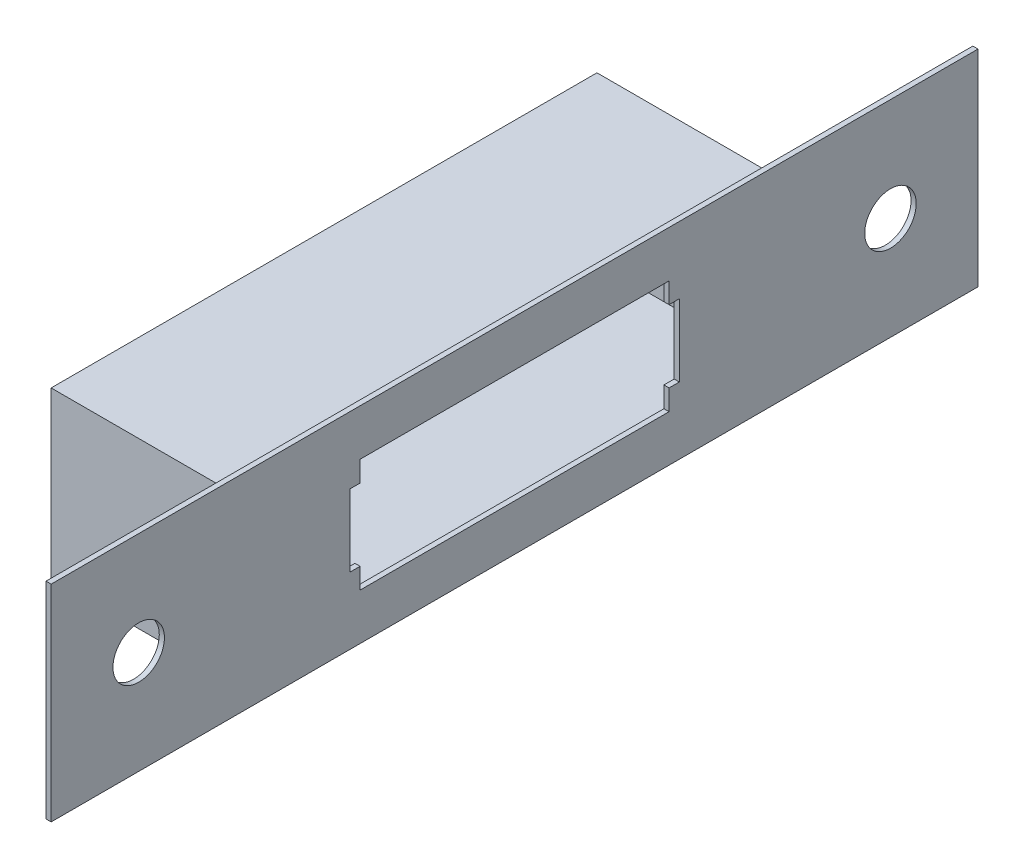
ISO-10303-21;
HEADER;
FILE_DESCRIPTION(('STEP AP214'),'2;1');
FILE_NAME('part.step','',(''),(''),'','','');
FILE_SCHEMA(('AUTOMOTIVE_DESIGN { 1 0 10303 214 1 1 1 1 }'));
ENDSEC;
DATA;
#1=APPLICATION_CONTEXT('core data for automotive mechanical design processes');
#2=APPLICATION_PROTOCOL_DEFINITION('international standard','automotive_design',2000,#1);
#3=PRODUCT_CONTEXT('',#1,'mechanical');
#4=PRODUCT('Part','Part','',(#3));
#5=PRODUCT_RELATED_PRODUCT_CATEGORY('part','',(#4));
#6=PRODUCT_DEFINITION_FORMATION('','',#4);
#7=PRODUCT_DEFINITION_CONTEXT('part definition',#1,'design');
#8=PRODUCT_DEFINITION('design','',#6,#7);
#9=PRODUCT_DEFINITION_SHAPE('','',#8);
#10=(LENGTH_UNIT() NAMED_UNIT(*) SI_UNIT(.MILLI.,.METRE.));
#11=(NAMED_UNIT(*) PLANE_ANGLE_UNIT() SI_UNIT($,.RADIAN.));
#12=(NAMED_UNIT(*) SI_UNIT($,.STERADIAN.) SOLID_ANGLE_UNIT());
#13=UNCERTAINTY_MEASURE_WITH_UNIT(LENGTH_MEASURE(1.E-05),#10,'distance_accuracy_value','');
#14=(GEOMETRIC_REPRESENTATION_CONTEXT(3) GLOBAL_UNCERTAINTY_ASSIGNED_CONTEXT((#13)) GLOBAL_UNIT_ASSIGNED_CONTEXT((#10,
#11,#12)) REPRESENTATION_CONTEXT('',''));
#15=CARTESIAN_POINT('',(0.,0.,0.));
#16=DIRECTION('',(0.,0.,1.));
#17=DIRECTION('',(1.,0.,0.));
#18=AXIS2_PLACEMENT_3D('',#15,#16,#17);
#19=CARTESIAN_POINT('',(18.,-8.,-26.5));
#20=DIRECTION('',(0.,0.,1.));
#21=DIRECTION('',(1.,0.,0.));
#22=AXIS2_PLACEMENT_3D('',#19,#20,#21);
#23=PLANE('',#22);
#24=DIRECTION('',(0.,1.,0.));
#25=VECTOR('',#24,1.);
#26=CARTESIAN_POINT('',(0.,-8.,-26.5));
#27=LINE('',#26,#25);
#28=CARTESIAN_POINT('',(0.,-8.,-26.5));
#29=VERTEX_POINT('',#28);
#30=CARTESIAN_POINT('',(0.,8.,-26.5));
#31=VERTEX_POINT('',#30);
#32=EDGE_CURVE('E416',#29,#31,#27,.T.);
#33=ORIENTED_EDGE('',*,*,#32,.T.);
#34=DIRECTION('',(-1.,0.,0.));
#35=VECTOR('',#34,1.);
#36=CARTESIAN_POINT('',(18.,8.,-26.5));
#37=LINE('',#36,#35);
#38=CARTESIAN_POINT('',(18.,8.,-26.5));
#39=VERTEX_POINT('',#38);
#40=EDGE_CURVE('E11',#39,#31,#37,.T.);
#41=ORIENTED_EDGE('',*,*,#40,.F.);
#42=DIRECTION('',(0.,1.,0.));
#43=VECTOR('',#42,1.);
#44=CARTESIAN_POINT('',(18.,-8.,-26.5));
#45=LINE('',#44,#43);
#46=CARTESIAN_POINT('',(18.,-8.,-26.5));
#47=VERTEX_POINT('',#46);
#48=EDGE_CURVE('E453',#47,#39,#45,.T.);
#49=ORIENTED_EDGE('',*,*,#48,.F.);
#50=DIRECTION('',(-1.,0.,0.));
#51=VECTOR('',#50,1.);
#52=CARTESIAN_POINT('',(18.,-8.,-26.5));
#53=LINE('',#52,#51);
#54=EDGE_CURVE('E467',#47,#29,#53,.T.);
#55=ORIENTED_EDGE('',*,*,#54,.T.);
#56=EDGE_LOOP('',(#33,#41,#49,#55));
#57=FACE_BOUND('',#56,.T.);
#58=ADVANCED_FACE('F44',(#57),#23,.F.);
#59=CARTESIAN_POINT('',(18.,8.,26.5));
#60=DIRECTION('',(0.,-1.,0.));
#61=DIRECTION('',(0.,0.,-1.));
#62=AXIS2_PLACEMENT_3D('',#59,#60,#61);
#63=PLANE('',#62);
#64=DIRECTION('',(0.,0.,1.));
#65=VECTOR('',#64,1.);
#66=CARTESIAN_POINT('',(0.,8.,26.5));
#67=LINE('',#66,#65);
#68=CARTESIAN_POINT('',(0.,8.,26.5));
#69=VERTEX_POINT('',#68);
#70=EDGE_CURVE('E471',#31,#69,#67,.T.);
#71=ORIENTED_EDGE('',*,*,#70,.T.);
#72=DIRECTION('',(-1.,0.,0.));
#73=VECTOR('',#72,1.);
#74=CARTESIAN_POINT('',(18.,8.,26.5));
#75=LINE('',#74,#73);
#76=CARTESIAN_POINT('',(18.,8.,26.5));
#77=VERTEX_POINT('',#76);
#78=EDGE_CURVE('E53',#77,#69,#75,.T.);
#79=ORIENTED_EDGE('',*,*,#78,.F.);
#80=DIRECTION('',(0.,0.,1.));
#81=VECTOR('',#80,1.);
#82=CARTESIAN_POINT('',(18.,8.,26.5));
#83=LINE('',#82,#81);
#84=EDGE_CURVE('E87',#39,#77,#83,.T.);
#85=ORIENTED_EDGE('',*,*,#84,.F.);
#86=ORIENTED_EDGE('',*,*,#40,.T.);
#87=EDGE_LOOP('',(#71,#79,#85,#86));
#88=FACE_BOUND('',#87,.T.);
#89=ADVANCED_FACE('F516',(#88),#63,.F.);
#90=CARTESIAN_POINT('',(18.,-8.,26.5));
#91=DIRECTION('',(0.,0.,-1.));
#92=DIRECTION('',(-1.,0.,0.));
#93=AXIS2_PLACEMENT_3D('',#90,#91,#92);
#94=PLANE('',#93);
#95=DIRECTION('',(0.,-1.,0.));
#96=VECTOR('',#95,1.);
#97=CARTESIAN_POINT('',(0.,-8.,26.5));
#98=LINE('',#97,#96);
#99=CARTESIAN_POINT('',(0.,-8.,26.5));
#100=VERTEX_POINT('',#99);
#101=EDGE_CURVE('E77',#69,#100,#98,.T.);
#102=ORIENTED_EDGE('',*,*,#101,.T.);
#103=DIRECTION('',(-1.,0.,0.));
#104=VECTOR('',#103,1.);
#105=CARTESIAN_POINT('',(18.,-8.,26.5));
#106=LINE('',#105,#104);
#107=CARTESIAN_POINT('',(18.,-8.,26.5));
#108=VERTEX_POINT('',#107);
#109=EDGE_CURVE('E61',#108,#100,#106,.T.);
#110=ORIENTED_EDGE('',*,*,#109,.F.);
#111=DIRECTION('',(0.,-1.,0.));
#112=VECTOR('',#111,1.);
#113=CARTESIAN_POINT('',(18.,-8.,26.5));
#114=LINE('',#113,#112);
#115=EDGE_CURVE('E459',#77,#108,#114,.T.);
#116=ORIENTED_EDGE('',*,*,#115,.F.);
#117=ORIENTED_EDGE('',*,*,#78,.T.);
#118=EDGE_LOOP('',(#102,#110,#116,#117));
#119=FACE_BOUND('',#118,.T.);
#120=ADVANCED_FACE('F482',(#119),#94,.F.);
#121=CARTESIAN_POINT('',(18.,-8.,26.5));
#122=DIRECTION('',(0.,1.,0.));
#123=DIRECTION('',(0.,0.,1.));
#124=AXIS2_PLACEMENT_3D('',#121,#122,#123);
#125=PLANE('',#124);
#126=DIRECTION('',(0.,0.,-1.));
#127=VECTOR('',#126,1.);
#128=CARTESIAN_POINT('',(0.,-8.,26.5));
#129=LINE('',#128,#127);
#130=EDGE_CURVE('E82',#100,#29,#129,.T.);
#131=ORIENTED_EDGE('',*,*,#130,.T.);
#132=ORIENTED_EDGE('',*,*,#54,.F.);
#133=DIRECTION('',(0.,0.,-1.));
#134=VECTOR('',#133,1.);
#135=CARTESIAN_POINT('',(18.,-8.,26.5));
#136=LINE('',#135,#134);
#137=EDGE_CURVE('E463',#108,#47,#136,.T.);
#138=ORIENTED_EDGE('',*,*,#137,.F.);
#139=ORIENTED_EDGE('',*,*,#109,.T.);
#140=EDGE_LOOP('',(#131,#132,#138,#139));
#141=FACE_BOUND('',#140,.T.);
#142=ADVANCED_FACE('F487',(#141),#125,.F.);
#143=CARTESIAN_POINT('',(0.,0.,0.));
#144=DIRECTION('',(-1.,0.,0.));
#145=DIRECTION('',(0.,0.,1.));
#146=AXIS2_PLACEMENT_3D('',#143,#144,#145);
#147=PLANE('',#146);
#148=ORIENTED_EDGE('',*,*,#32,.F.);
#149=ORIENTED_EDGE('',*,*,#130,.F.);
#150=ORIENTED_EDGE('',*,*,#101,.F.);
#151=ORIENTED_EDGE('',*,*,#70,.F.);
#152=EDGE_LOOP('',(#148,#149,#150,#151));
#153=FACE_BOUND('',#152,.T.);
#154=ADVANCED_FACE('F485',(#153),#147,.T.);
#155=CARTESIAN_POINT('',(18.,0.,0.));
#156=DIRECTION('',(-1.,0.,0.));
#157=DIRECTION('',(0.,0.,1.));
#158=AXIS2_PLACEMENT_3D('',#155,#156,#157);
#159=PLANE('',#158);
#160=DIRECTION('',(0.,0.,1.));
#161=VECTOR('',#160,1.);
#162=CARTESIAN_POINT('',(18.,3.5,-15.));
#163=LINE('',#162,#161);
#164=CARTESIAN_POINT('',(18.,3.5,-16.));
#165=VERTEX_POINT('',#164);
#166=CARTESIAN_POINT('',(18.,3.5,-15.));
#167=VERTEX_POINT('',#166);
#168=EDGE_CURVE('E227',#165,#167,#163,.T.);
#169=ORIENTED_EDGE('',*,*,#168,.T.);
#170=DIRECTION('',(0.,1.,0.));
#171=VECTOR('',#170,1.);
#172=CARTESIAN_POINT('',(18.,5.5,-15.));
#173=LINE('',#172,#171);
#174=CARTESIAN_POINT('',(18.,5.5,-15.));
#175=VERTEX_POINT('',#174);
#176=EDGE_CURVE('E275',#167,#175,#173,.T.);
#177=ORIENTED_EDGE('',*,*,#176,.T.);
#178=DIRECTION('',(0.,0.,1.));
#179=VECTOR('',#178,1.);
#180=CARTESIAN_POINT('',(18.,5.5,15.));
#181=LINE('',#180,#179);
#182=CARTESIAN_POINT('',(18.,5.5,15.));
#183=VERTEX_POINT('',#182);
#184=EDGE_CURVE('E233',#175,#183,#181,.T.);
#185=ORIENTED_EDGE('',*,*,#184,.T.);
#186=DIRECTION('',(0.,-1.,0.));
#187=VECTOR('',#186,1.);
#188=CARTESIAN_POINT('',(18.,5.5,15.));
#189=LINE('',#188,#187);
#190=CARTESIAN_POINT('',(18.,3.5,15.));
#191=VERTEX_POINT('',#190);
#192=EDGE_CURVE('E280',#183,#191,#189,.T.);
#193=ORIENTED_EDGE('',*,*,#192,.T.);
#194=DIRECTION('',(0.,0.,1.));
#195=VECTOR('',#194,1.);
#196=CARTESIAN_POINT('',(18.,3.5,16.));
#197=LINE('',#196,#195);
#198=CARTESIAN_POINT('',(18.,3.5,16.));
#199=VERTEX_POINT('',#198);
#200=EDGE_CURVE('E284',#191,#199,#197,.T.);
#201=ORIENTED_EDGE('',*,*,#200,.T.);
#202=DIRECTION('',(0.,-1.,0.));
#203=VECTOR('',#202,1.);
#204=CARTESIAN_POINT('',(18.,-3.5,16.));
#205=LINE('',#204,#203);
#206=CARTESIAN_POINT('',(18.,-3.5,16.));
#207=VERTEX_POINT('',#206);
#208=EDGE_CURVE('E288',#199,#207,#205,.T.);
#209=ORIENTED_EDGE('',*,*,#208,.T.);
#210=DIRECTION('',(0.,0.,-1.));
#211=VECTOR('',#210,1.);
#212=CARTESIAN_POINT('',(18.,-3.5,16.));
#213=LINE('',#212,#211);
#214=CARTESIAN_POINT('',(18.,-3.5,15.));
#215=VERTEX_POINT('',#214);
#216=EDGE_CURVE('E292',#207,#215,#213,.T.);
#217=ORIENTED_EDGE('',*,*,#216,.T.);
#218=DIRECTION('',(0.,-1.,0.));
#219=VECTOR('',#218,1.);
#220=CARTESIAN_POINT('',(18.,-5.5,15.));
#221=LINE('',#220,#219);
#222=CARTESIAN_POINT('',(18.,-5.5,15.));
#223=VERTEX_POINT('',#222);
#224=EDGE_CURVE('E296',#215,#223,#221,.T.);
#225=ORIENTED_EDGE('',*,*,#224,.T.);
#226=DIRECTION('',(0.,0.,-1.));
#227=VECTOR('',#226,1.);
#228=CARTESIAN_POINT('',(18.,-5.5,15.));
#229=LINE('',#228,#227);
#230=CARTESIAN_POINT('',(18.,-5.5,-15.));
#231=VERTEX_POINT('',#230);
#232=EDGE_CURVE('E300',#223,#231,#229,.T.);
#233=ORIENTED_EDGE('',*,*,#232,.T.);
#234=DIRECTION('',(0.,1.,0.));
#235=VECTOR('',#234,1.);
#236=CARTESIAN_POINT('',(18.,-3.5,-15.));
#237=LINE('',#236,#235);
#238=CARTESIAN_POINT('',(18.,-3.5,-15.));
#239=VERTEX_POINT('',#238);
#240=EDGE_CURVE('E304',#231,#239,#237,.T.);
#241=ORIENTED_EDGE('',*,*,#240,.T.);
#242=DIRECTION('',(0.,0.,-1.));
#243=VECTOR('',#242,1.);
#244=CARTESIAN_POINT('',(18.,-3.5,-16.));
#245=LINE('',#244,#243);
#246=CARTESIAN_POINT('',(18.,-3.5,-16.));
#247=VERTEX_POINT('',#246);
#248=EDGE_CURVE('E308',#239,#247,#245,.T.);
#249=ORIENTED_EDGE('',*,*,#248,.T.);
#250=DIRECTION('',(0.,1.,0.));
#251=VECTOR('',#250,1.);
#252=CARTESIAN_POINT('',(18.,-3.5,-16.));
#253=LINE('',#252,#251);
#254=EDGE_CURVE('E312',#247,#165,#253,.T.);
#255=ORIENTED_EDGE('',*,*,#254,.T.);
#256=EDGE_LOOP('',(#169,#177,#185,#193,#201,#209,#217,#225,#233,#241,#249,#255));
#257=FACE_BOUND('',#256,.T.);
#258=DIRECTION('',(0.,1.,0.));
#259=VECTOR('',#258,1.);
#260=CARTESIAN_POINT('',(18.,0.,-26.));
#261=LINE('',#260,#259);
#262=CARTESIAN_POINT('',(18.,-7.5,-26.));
#263=VERTEX_POINT('',#262);
#264=CARTESIAN_POINT('',(18.,7.5,-26.));
#265=VERTEX_POINT('',#264);
#266=EDGE_CURVE('E438',#263,#265,#261,.T.);
#267=ORIENTED_EDGE('',*,*,#266,.F.);
#268=DIRECTION('',(0.,0.,-1.));
#269=VECTOR('',#268,1.);
#270=CARTESIAN_POINT('',(18.,-7.5,0.));
#271=LINE('',#270,#269);
#272=CARTESIAN_POINT('',(18.,-7.5,26.));
#273=VERTEX_POINT('',#272);
#274=EDGE_CURVE('E423',#273,#263,#271,.T.);
#275=ORIENTED_EDGE('',*,*,#274,.F.);
#276=DIRECTION('',(0.,-1.,0.));
#277=VECTOR('',#276,1.);
#278=CARTESIAN_POINT('',(18.,0.,26.));
#279=LINE('',#278,#277);
#280=CARTESIAN_POINT('',(18.,7.5,26.));
#281=VERTEX_POINT('',#280);
#282=EDGE_CURVE('E446',#281,#273,#279,.T.);
#283=ORIENTED_EDGE('',*,*,#282,.F.);
#284=DIRECTION('',(0.,0.,1.));
#285=VECTOR('',#284,1.);
#286=CARTESIAN_POINT('',(18.,7.5,0.));
#287=LINE('',#286,#285);
#288=EDGE_CURVE('E442',#265,#281,#287,.T.);
#289=ORIENTED_EDGE('',*,*,#288,.F.);
#290=EDGE_LOOP('',(#267,#275,#283,#289));
#291=FACE_BOUND('',#290,.T.);
#292=ADVANCED_FACE('F494',(#257,#291),#159,.T.);
#293=CARTESIAN_POINT('',(18.5,0.,0.));
#294=DIRECTION('',(-1.,0.,0.));
#295=DIRECTION('',(0.,0.,1.));
#296=AXIS2_PLACEMENT_3D('',#293,#294,#295);
#297=PLANE('',#296);
#298=CARTESIAN_POINT('',(18.5,0.,36.5));
#299=DIRECTION('',(1.,0.,0.));
#300=DIRECTION('',(0.,0.,-1.));
#301=AXIS2_PLACEMENT_3D('',#298,#299,#300);
#302=CIRCLE('',#301,2.5);
#303=CARTESIAN_POINT('',(18.5,0.,34.));
#304=VERTEX_POINT('',#303);
#305=EDGE_CURVE('E350',#304,#304,#302,.T.);
#306=ORIENTED_EDGE('',*,*,#305,.F.);
#307=EDGE_LOOP('',(#306));
#308=FACE_BOUND('',#307,.T.);
#309=CARTESIAN_POINT('',(18.5,0.,-36.5));
#310=DIRECTION('',(1.,0.,0.));
#311=DIRECTION('',(0.,0.,-1.));
#312=AXIS2_PLACEMENT_3D('',#309,#310,#311);
#313=CIRCLE('',#312,2.5);
#314=CARTESIAN_POINT('',(18.5,0.,-39.));
#315=VERTEX_POINT('',#314);
#316=EDGE_CURVE('E358',#315,#315,#313,.T.);
#317=ORIENTED_EDGE('',*,*,#316,.F.);
#318=EDGE_LOOP('',(#317));
#319=FACE_BOUND('',#318,.T.);
#320=DIRECTION('',(0.,1.,0.));
#321=VECTOR('',#320,1.);
#322=CARTESIAN_POINT('',(18.5,-10.,-45.));
#323=LINE('',#322,#321);
#324=CARTESIAN_POINT('',(18.5,-10.,-45.));
#325=VERTEX_POINT('',#324);
#326=CARTESIAN_POINT('',(18.5,10.,-45.));
#327=VERTEX_POINT('',#326);
#328=EDGE_CURVE('E366',#325,#327,#323,.T.);
#329=ORIENTED_EDGE('',*,*,#328,.T.);
#330=DIRECTION('',(0.,0.,1.));
#331=VECTOR('',#330,1.);
#332=CARTESIAN_POINT('',(18.5,10.,45.));
#333=LINE('',#332,#331);
#334=CARTESIAN_POINT('',(18.5,10.,45.));
#335=VERTEX_POINT('',#334);
#336=EDGE_CURVE('E370',#327,#335,#333,.T.);
#337=ORIENTED_EDGE('',*,*,#336,.T.);
#338=DIRECTION('',(0.,-1.,0.));
#339=VECTOR('',#338,1.);
#340=CARTESIAN_POINT('',(18.5,-10.,45.));
#341=LINE('',#340,#339);
#342=CARTESIAN_POINT('',(18.5,-10.,45.));
#343=VERTEX_POINT('',#342);
#344=EDGE_CURVE('E374',#335,#343,#341,.T.);
#345=ORIENTED_EDGE('',*,*,#344,.T.);
#346=DIRECTION('',(0.,0.,-1.));
#347=VECTOR('',#346,1.);
#348=CARTESIAN_POINT('',(18.5,-10.,45.));
#349=LINE('',#348,#347);
#350=EDGE_CURVE('E377',#343,#325,#349,.T.);
#351=ORIENTED_EDGE('',*,*,#350,.T.);
#352=EDGE_LOOP('',(#329,#337,#345,#351));
#353=FACE_BOUND('',#352,.T.);
#354=DIRECTION('',(0.,1.,0.));
#355=VECTOR('',#354,1.);
#356=CARTESIAN_POINT('',(18.5,5.5,-15.));
#357=LINE('',#356,#355);
#358=CARTESIAN_POINT('',(18.5,3.5,-15.));
#359=VERTEX_POINT('',#358);
#360=CARTESIAN_POINT('',(18.5,5.5,-15.));
#361=VERTEX_POINT('',#360);
#362=EDGE_CURVE('E215',#359,#361,#357,.T.);
#363=ORIENTED_EDGE('',*,*,#362,.F.);
#364=DIRECTION('',(0.,0.,1.));
#365=VECTOR('',#364,1.);
#366=CARTESIAN_POINT('',(18.5,3.5,-15.));
#367=LINE('',#366,#365);
#368=CARTESIAN_POINT('',(18.5,3.5,-16.));
#369=VERTEX_POINT('',#368);
#370=EDGE_CURVE('E272',#369,#359,#367,.T.);
#371=ORIENTED_EDGE('',*,*,#370,.F.);
#372=DIRECTION('',(0.,1.,0.));
#373=VECTOR('',#372,1.);
#374=CARTESIAN_POINT('',(18.5,-3.5,-16.));
#375=LINE('',#374,#373);
#376=CARTESIAN_POINT('',(18.5,-3.5,-16.));
#377=VERTEX_POINT('',#376);
#378=EDGE_CURVE('E268',#377,#369,#375,.T.);
#379=ORIENTED_EDGE('',*,*,#378,.F.);
#380=DIRECTION('',(0.,0.,-1.));
#381=VECTOR('',#380,1.);
#382=CARTESIAN_POINT('',(18.5,-3.5,-16.));
#383=LINE('',#382,#381);
#384=CARTESIAN_POINT('',(18.5,-3.5,-15.));
#385=VERTEX_POINT('',#384);
#386=EDGE_CURVE('E265',#385,#377,#383,.T.);
#387=ORIENTED_EDGE('',*,*,#386,.F.);
#388=DIRECTION('',(0.,1.,0.));
#389=VECTOR('',#388,1.);
#390=CARTESIAN_POINT('',(18.5,-3.5,-15.));
#391=LINE('',#390,#389);
#392=CARTESIAN_POINT('',(18.5,-5.5,-15.));
#393=VERTEX_POINT('',#392);
#394=EDGE_CURVE('E262',#393,#385,#391,.T.);
#395=ORIENTED_EDGE('',*,*,#394,.F.);
#396=DIRECTION('',(0.,0.,-1.));
#397=VECTOR('',#396,1.);
#398=CARTESIAN_POINT('',(18.5,-5.5,15.));
#399=LINE('',#398,#397);
#400=CARTESIAN_POINT('',(18.5,-5.5,15.));
#401=VERTEX_POINT('',#400);
#402=EDGE_CURVE('E259',#401,#393,#399,.T.);
#403=ORIENTED_EDGE('',*,*,#402,.F.);
#404=DIRECTION('',(0.,-1.,0.));
#405=VECTOR('',#404,1.);
#406=CARTESIAN_POINT('',(18.5,-5.5,15.));
#407=LINE('',#406,#405);
#408=CARTESIAN_POINT('',(18.5,-3.5,15.));
#409=VERTEX_POINT('',#408);
#410=EDGE_CURVE('E256',#409,#401,#407,.T.);
#411=ORIENTED_EDGE('',*,*,#410,.F.);
#412=DIRECTION('',(0.,0.,-1.));
#413=VECTOR('',#412,1.);
#414=CARTESIAN_POINT('',(18.5,-3.5,16.));
#415=LINE('',#414,#413);
#416=CARTESIAN_POINT('',(18.5,-3.5,16.));
#417=VERTEX_POINT('',#416);
#418=EDGE_CURVE('E253',#417,#409,#415,.T.);
#419=ORIENTED_EDGE('',*,*,#418,.F.);
#420=DIRECTION('',(0.,-1.,0.));
#421=VECTOR('',#420,1.);
#422=CARTESIAN_POINT('',(18.5,-3.5,16.));
#423=LINE('',#422,#421);
#424=CARTESIAN_POINT('',(18.5,3.5,16.));
#425=VERTEX_POINT('',#424);
#426=EDGE_CURVE('E250',#425,#417,#423,.T.);
#427=ORIENTED_EDGE('',*,*,#426,.F.);
#428=DIRECTION('',(0.,0.,1.));
#429=VECTOR('',#428,1.);
#430=CARTESIAN_POINT('',(18.5,3.5,16.));
#431=LINE('',#430,#429);
#432=CARTESIAN_POINT('',(18.5,3.5,15.));
#433=VERTEX_POINT('',#432);
#434=EDGE_CURVE('E245',#433,#425,#431,.T.);
#435=ORIENTED_EDGE('',*,*,#434,.F.);
#436=DIRECTION('',(0.,-1.,0.));
#437=VECTOR('',#436,1.);
#438=CARTESIAN_POINT('',(18.5,5.5,15.));
#439=LINE('',#438,#437);
#440=CARTESIAN_POINT('',(18.5,5.5,15.));
#441=VERTEX_POINT('',#440);
#442=EDGE_CURVE('E241',#441,#433,#439,.T.);
#443=ORIENTED_EDGE('',*,*,#442,.F.);
#444=DIRECTION('',(0.,0.,1.));
#445=VECTOR('',#444,1.);
#446=CARTESIAN_POINT('',(18.5,5.5,15.));
#447=LINE('',#446,#445);
#448=EDGE_CURVE('E226',#361,#441,#447,.T.);
#449=ORIENTED_EDGE('',*,*,#448,.F.);
#450=EDGE_LOOP('',(#363,#371,#379,#387,#395,#403,#411,#419,#427,#435,#443,#449));
#451=FACE_BOUND('',#450,.T.);
#452=ADVANCED_FACE('F239',(#308,#319,#353,#451),#297,.F.);
#453=ORIENTED_EDGE('',*,*,#137,.T.);
#454=ORIENTED_EDGE('',*,*,#48,.T.);
#455=ORIENTED_EDGE('',*,*,#84,.T.);
#456=ORIENTED_EDGE('',*,*,#115,.T.);
#457=EDGE_LOOP('',(#453,#454,#455,#456));
#458=FACE_BOUND('',#457,.T.);
#459=CARTESIAN_POINT('',(18.,0.,-36.5));
#460=DIRECTION('',(1.,0.,0.));
#461=DIRECTION('',(0.,0.,-1.));
#462=AXIS2_PLACEMENT_3D('',#459,#460,#461);
#463=CIRCLE('',#462,2.5);
#464=CARTESIAN_POINT('',(18.,0.,-39.));
#465=VERTEX_POINT('',#464);
#466=EDGE_CURVE('E354',#465,#465,#463,.T.);
#467=ORIENTED_EDGE('',*,*,#466,.T.);
#468=EDGE_LOOP('',(#467));
#469=FACE_BOUND('',#468,.T.);
#470=DIRECTION('',(0.,1.,0.));
#471=VECTOR('',#470,1.);
#472=CARTESIAN_POINT('',(18.,-10.,-45.));
#473=LINE('',#472,#471);
#474=CARTESIAN_POINT('',(18.,-10.,-45.));
#475=VERTEX_POINT('',#474);
#476=CARTESIAN_POINT('',(18.,10.,-45.));
#477=VERTEX_POINT('',#476);
#478=EDGE_CURVE('E362',#475,#477,#473,.T.);
#479=ORIENTED_EDGE('',*,*,#478,.F.);
#480=DIRECTION('',(0.,0.,-1.));
#481=VECTOR('',#480,1.);
#482=CARTESIAN_POINT('',(18.,-10.,45.));
#483=LINE('',#482,#481);
#484=CARTESIAN_POINT('',(18.,-10.,45.));
#485=VERTEX_POINT('',#484);
#486=EDGE_CURVE('E371',#485,#475,#483,.T.);
#487=ORIENTED_EDGE('',*,*,#486,.F.);
#488=DIRECTION('',(0.,-1.,0.));
#489=VECTOR('',#488,1.);
#490=CARTESIAN_POINT('',(18.,-10.,45.));
#491=LINE('',#490,#489);
#492=CARTESIAN_POINT('',(18.,10.,45.));
#493=VERTEX_POINT('',#492);
#494=EDGE_CURVE('E387',#493,#485,#491,.T.);
#495=ORIENTED_EDGE('',*,*,#494,.F.);
#496=DIRECTION('',(0.,0.,1.));
#497=VECTOR('',#496,1.);
#498=CARTESIAN_POINT('',(18.,10.,45.));
#499=LINE('',#498,#497);
#500=EDGE_CURVE('E384',#477,#493,#499,.T.);
#501=ORIENTED_EDGE('',*,*,#500,.F.);
#502=EDGE_LOOP('',(#479,#487,#495,#501));
#503=FACE_BOUND('',#502,.T.);
#504=CARTESIAN_POINT('',(18.,0.,36.5));
#505=DIRECTION('',(1.,0.,0.));
#506=DIRECTION('',(0.,0.,-1.));
#507=AXIS2_PLACEMENT_3D('',#504,#505,#506);
#508=CIRCLE('',#507,2.5);
#509=CARTESIAN_POINT('',(18.,0.,34.));
#510=VERTEX_POINT('',#509);
#511=EDGE_CURVE('E235',#510,#510,#508,.T.);
#512=ORIENTED_EDGE('',*,*,#511,.T.);
#513=EDGE_LOOP('',(#512));
#514=FACE_BOUND('',#513,.T.);
#515=ADVANCED_FACE('F489',(#458,#469,#503,#514),#159,.T.);
#516=CARTESIAN_POINT('',(18.5,-10.,-45.));
#517=DIRECTION('',(0.,0.,1.));
#518=DIRECTION('',(1.,0.,0.));
#519=AXIS2_PLACEMENT_3D('',#516,#517,#518);
#520=PLANE('',#519);
#521=ORIENTED_EDGE('',*,*,#478,.T.);
#522=DIRECTION('',(-1.,0.,0.));
#523=VECTOR('',#522,1.);
#524=CARTESIAN_POINT('',(18.5,10.,-45.));
#525=LINE('',#524,#523);
#526=EDGE_CURVE('E403',#327,#477,#525,.T.);
#527=ORIENTED_EDGE('',*,*,#526,.F.);
#528=ORIENTED_EDGE('',*,*,#328,.F.);
#529=DIRECTION('',(-1.,0.,0.));
#530=VECTOR('',#529,1.);
#531=CARTESIAN_POINT('',(18.5,-10.,-45.));
#532=LINE('',#531,#530);
#533=EDGE_CURVE('E380',#325,#475,#532,.T.);
#534=ORIENTED_EDGE('',*,*,#533,.T.);
#535=EDGE_LOOP('',(#521,#527,#528,#534));
#536=FACE_BOUND('',#535,.T.);
#537=ADVANCED_FACE('F492',(#536),#520,.F.);
#538=CARTESIAN_POINT('',(18.5,10.,45.));
#539=DIRECTION('',(0.,-1.,0.));
#540=DIRECTION('',(0.,0.,-1.));
#541=AXIS2_PLACEMENT_3D('',#538,#539,#540);
#542=PLANE('',#541);
#543=ORIENTED_EDGE('',*,*,#500,.T.);
#544=DIRECTION('',(-1.,0.,0.));
#545=VECTOR('',#544,1.);
#546=CARTESIAN_POINT('',(18.5,10.,45.));
#547=LINE('',#546,#545);
#548=EDGE_CURVE('E399',#335,#493,#547,.T.);
#549=ORIENTED_EDGE('',*,*,#548,.F.);
#550=ORIENTED_EDGE('',*,*,#336,.F.);
#551=ORIENTED_EDGE('',*,*,#526,.T.);
#552=EDGE_LOOP('',(#543,#549,#550,#551));
#553=FACE_BOUND('',#552,.T.);
#554=ADVANCED_FACE('F552',(#553),#542,.F.);
#555=CARTESIAN_POINT('',(18.5,-10.,45.));
#556=DIRECTION('',(0.,0.,-1.));
#557=DIRECTION('',(-1.,0.,0.));
#558=AXIS2_PLACEMENT_3D('',#555,#556,#557);
#559=PLANE('',#558);
#560=ORIENTED_EDGE('',*,*,#494,.T.);
#561=DIRECTION('',(-1.,0.,0.));
#562=VECTOR('',#561,1.);
#563=CARTESIAN_POINT('',(18.5,-10.,45.));
#564=LINE('',#563,#562);
#565=EDGE_CURVE('E395',#343,#485,#564,.T.);
#566=ORIENTED_EDGE('',*,*,#565,.F.);
#567=ORIENTED_EDGE('',*,*,#344,.F.);
#568=ORIENTED_EDGE('',*,*,#548,.T.);
#569=EDGE_LOOP('',(#560,#566,#567,#568));
#570=FACE_BOUND('',#569,.T.);
#571=ADVANCED_FACE('F556',(#570),#559,.F.);
#572=CARTESIAN_POINT('',(18.5,-10.,45.));
#573=DIRECTION('',(0.,1.,0.));
#574=DIRECTION('',(0.,0.,1.));
#575=AXIS2_PLACEMENT_3D('',#572,#573,#574);
#576=PLANE('',#575);
#577=ORIENTED_EDGE('',*,*,#486,.T.);
#578=ORIENTED_EDGE('',*,*,#533,.F.);
#579=ORIENTED_EDGE('',*,*,#350,.F.);
#580=ORIENTED_EDGE('',*,*,#565,.T.);
#581=EDGE_LOOP('',(#577,#578,#579,#580));
#582=FACE_BOUND('',#581,.T.);
#583=ADVANCED_FACE('F512',(#582),#576,.F.);
#584=CARTESIAN_POINT('',(18.5,0.,-36.5));
#585=DIRECTION('',(-1.,0.,0.));
#586=DIRECTION('',(0.,0.,1.));
#587=AXIS2_PLACEMENT_3D('',#584,#585,#586);
#588=CYLINDRICAL_SURFACE('',#587,2.5);
#589=ORIENTED_EDGE('',*,*,#316,.T.);
#590=EDGE_LOOP('',(#589));
#591=FACE_BOUND('',#590,.T.);
#592=ORIENTED_EDGE('',*,*,#466,.F.);
#593=EDGE_LOOP('',(#592));
#594=FACE_BOUND('',#593,.T.);
#595=ADVANCED_FACE('F504',(#591,#594),#588,.F.);
#596=CARTESIAN_POINT('',(18.5,0.,36.5));
#597=DIRECTION('',(-1.,0.,0.));
#598=DIRECTION('',(0.,0.,1.));
#599=AXIS2_PLACEMENT_3D('',#596,#597,#598);
#600=CYLINDRICAL_SURFACE('',#599,2.5);
#601=ORIENTED_EDGE('',*,*,#305,.T.);
#602=EDGE_LOOP('',(#601));
#603=FACE_BOUND('',#602,.T.);
#604=ORIENTED_EDGE('',*,*,#511,.F.);
#605=EDGE_LOOP('',(#604));
#606=FACE_BOUND('',#605,.T.);
#607=ADVANCED_FACE('F502',(#603,#606),#600,.F.);
#608=CARTESIAN_POINT('',(18.5,5.5,-15.));
#609=DIRECTION('',(0.,0.,1.));
#610=DIRECTION('',(1.,0.,0.));
#611=AXIS2_PLACEMENT_3D('',#608,#609,#610);
#612=PLANE('',#611);
#613=ORIENTED_EDGE('',*,*,#176,.F.);
#614=DIRECTION('',(-1.,0.,0.));
#615=VECTOR('',#614,1.);
#616=CARTESIAN_POINT('',(18.5,3.5,-15.));
#617=LINE('',#616,#615);
#618=EDGE_CURVE('E221',#359,#167,#617,.T.);
#619=ORIENTED_EDGE('',*,*,#618,.F.);
#620=ORIENTED_EDGE('',*,*,#362,.T.);
#621=DIRECTION('',(-1.,0.,0.));
#622=VECTOR('',#621,1.);
#623=CARTESIAN_POINT('',(18.5,5.5,-15.));
#624=LINE('',#623,#622);
#625=EDGE_CURVE('E218',#361,#175,#624,.T.);
#626=ORIENTED_EDGE('',*,*,#625,.T.);
#627=EDGE_LOOP('',(#613,#619,#620,#626));
#628=FACE_BOUND('',#627,.T.);
#629=ADVANCED_FACE('F217',(#628),#612,.T.);
#630=CARTESIAN_POINT('',(18.5,5.5,15.));
#631=DIRECTION('',(0.,-1.,0.));
#632=DIRECTION('',(0.,0.,-1.));
#633=AXIS2_PLACEMENT_3D('',#630,#631,#632);
#634=PLANE('',#633);
#635=ORIENTED_EDGE('',*,*,#184,.F.);
#636=ORIENTED_EDGE('',*,*,#625,.F.);
#637=ORIENTED_EDGE('',*,*,#448,.T.);
#638=DIRECTION('',(-1.,0.,0.));
#639=VECTOR('',#638,1.);
#640=CARTESIAN_POINT('',(18.5,5.5,15.));
#641=LINE('',#640,#639);
#642=EDGE_CURVE('E236',#441,#183,#641,.T.);
#643=ORIENTED_EDGE('',*,*,#642,.T.);
#644=EDGE_LOOP('',(#635,#636,#637,#643));
#645=FACE_BOUND('',#644,.T.);
#646=ADVANCED_FACE('F230',(#645),#634,.T.);
#647=CARTESIAN_POINT('',(18.5,5.5,15.));
#648=DIRECTION('',(0.,0.,-1.));
#649=DIRECTION('',(-1.,0.,0.));
#650=AXIS2_PLACEMENT_3D('',#647,#648,#649);
#651=PLANE('',#650);
#652=ORIENTED_EDGE('',*,*,#192,.F.);
#653=ORIENTED_EDGE('',*,*,#642,.F.);
#654=ORIENTED_EDGE('',*,*,#442,.T.);
#655=DIRECTION('',(-1.,0.,0.));
#656=VECTOR('',#655,1.);
#657=CARTESIAN_POINT('',(18.5,3.5,15.));
#658=LINE('',#657,#656);
#659=EDGE_CURVE('E345',#433,#191,#658,.T.);
#660=ORIENTED_EDGE('',*,*,#659,.T.);
#661=EDGE_LOOP('',(#652,#653,#654,#660));
#662=FACE_BOUND('',#661,.T.);
#663=ADVANCED_FACE('F636',(#662),#651,.T.);
#664=CARTESIAN_POINT('',(18.5,3.5,16.));
#665=DIRECTION('',(0.,-1.,0.));
#666=DIRECTION('',(0.,0.,-1.));
#667=AXIS2_PLACEMENT_3D('',#664,#665,#666);
#668=PLANE('',#667);
#669=ORIENTED_EDGE('',*,*,#200,.F.);
#670=ORIENTED_EDGE('',*,*,#659,.F.);
#671=ORIENTED_EDGE('',*,*,#434,.T.);
#672=DIRECTION('',(-1.,0.,0.));
#673=VECTOR('',#672,1.);
#674=CARTESIAN_POINT('',(18.5,3.5,16.));
#675=LINE('',#674,#673);
#676=EDGE_CURVE('E342',#425,#199,#675,.T.);
#677=ORIENTED_EDGE('',*,*,#676,.T.);
#678=EDGE_LOOP('',(#669,#670,#671,#677));
#679=FACE_BOUND('',#678,.T.);
#680=ADVANCED_FACE('F632',(#679),#668,.T.);
#681=CARTESIAN_POINT('',(18.5,-3.5,16.));
#682=DIRECTION('',(0.,0.,-1.));
#683=DIRECTION('',(-1.,0.,0.));
#684=AXIS2_PLACEMENT_3D('',#681,#682,#683);
#685=PLANE('',#684);
#686=ORIENTED_EDGE('',*,*,#208,.F.);
#687=ORIENTED_EDGE('',*,*,#676,.F.);
#688=ORIENTED_EDGE('',*,*,#426,.T.);
#689=DIRECTION('',(-1.,0.,0.));
#690=VECTOR('',#689,1.);
#691=CARTESIAN_POINT('',(18.5,-3.5,16.));
#692=LINE('',#691,#690);
#693=EDGE_CURVE('E339',#417,#207,#692,.T.);
#694=ORIENTED_EDGE('',*,*,#693,.T.);
#695=EDGE_LOOP('',(#686,#687,#688,#694));
#696=FACE_BOUND('',#695,.T.);
#697=ADVANCED_FACE('F629',(#696),#685,.T.);
#698=CARTESIAN_POINT('',(18.5,-3.5,16.));
#699=DIRECTION('',(0.,1.,0.));
#700=DIRECTION('',(0.,0.,1.));
#701=AXIS2_PLACEMENT_3D('',#698,#699,#700);
#702=PLANE('',#701);
#703=ORIENTED_EDGE('',*,*,#216,.F.);
#704=ORIENTED_EDGE('',*,*,#693,.F.);
#705=ORIENTED_EDGE('',*,*,#418,.T.);
#706=DIRECTION('',(-1.,0.,0.));
#707=VECTOR('',#706,1.);
#708=CARTESIAN_POINT('',(18.5,-3.5,15.));
#709=LINE('',#708,#707);
#710=EDGE_CURVE('E336',#409,#215,#709,.T.);
#711=ORIENTED_EDGE('',*,*,#710,.T.);
#712=EDGE_LOOP('',(#703,#704,#705,#711));
#713=FACE_BOUND('',#712,.T.);
#714=ADVANCED_FACE('F623',(#713),#702,.T.);
#715=CARTESIAN_POINT('',(18.5,-5.5,15.));
#716=DIRECTION('',(0.,0.,-1.));
#717=DIRECTION('',(-1.,0.,0.));
#718=AXIS2_PLACEMENT_3D('',#715,#716,#717);
#719=PLANE('',#718);
#720=ORIENTED_EDGE('',*,*,#224,.F.);
#721=ORIENTED_EDGE('',*,*,#710,.F.);
#722=ORIENTED_EDGE('',*,*,#410,.T.);
#723=DIRECTION('',(-1.,0.,0.));
#724=VECTOR('',#723,1.);
#725=CARTESIAN_POINT('',(18.5,-5.5,15.));
#726=LINE('',#725,#724);
#727=EDGE_CURVE('E333',#401,#223,#726,.T.);
#728=ORIENTED_EDGE('',*,*,#727,.T.);
#729=EDGE_LOOP('',(#720,#721,#722,#728));
#730=FACE_BOUND('',#729,.T.);
#731=ADVANCED_FACE('F619',(#730),#719,.T.);
#732=CARTESIAN_POINT('',(18.5,-5.5,15.));
#733=DIRECTION('',(0.,1.,0.));
#734=DIRECTION('',(0.,0.,1.));
#735=AXIS2_PLACEMENT_3D('',#732,#733,#734);
#736=PLANE('',#735);
#737=ORIENTED_EDGE('',*,*,#232,.F.);
#738=ORIENTED_EDGE('',*,*,#727,.F.);
#739=ORIENTED_EDGE('',*,*,#402,.T.);
#740=DIRECTION('',(-1.,0.,0.));
#741=VECTOR('',#740,1.);
#742=CARTESIAN_POINT('',(18.5,-5.5,-15.));
#743=LINE('',#742,#741);
#744=EDGE_CURVE('E330',#393,#231,#743,.T.);
#745=ORIENTED_EDGE('',*,*,#744,.T.);
#746=EDGE_LOOP('',(#737,#738,#739,#745));
#747=FACE_BOUND('',#746,.T.);
#748=ADVANCED_FACE('F616',(#747),#736,.T.);
#749=CARTESIAN_POINT('',(18.5,-3.5,-15.));
#750=DIRECTION('',(0.,0.,1.));
#751=DIRECTION('',(1.,0.,0.));
#752=AXIS2_PLACEMENT_3D('',#749,#750,#751);
#753=PLANE('',#752);
#754=ORIENTED_EDGE('',*,*,#240,.F.);
#755=ORIENTED_EDGE('',*,*,#744,.F.);
#756=ORIENTED_EDGE('',*,*,#394,.T.);
#757=DIRECTION('',(-1.,0.,0.));
#758=VECTOR('',#757,1.);
#759=CARTESIAN_POINT('',(18.5,-3.5,-15.));
#760=LINE('',#759,#758);
#761=EDGE_CURVE('E327',#385,#239,#760,.T.);
#762=ORIENTED_EDGE('',*,*,#761,.T.);
#763=EDGE_LOOP('',(#754,#755,#756,#762));
#764=FACE_BOUND('',#763,.T.);
#765=ADVANCED_FACE('F608',(#764),#753,.T.);
#766=CARTESIAN_POINT('',(18.5,-3.5,-16.));
#767=DIRECTION('',(0.,1.,0.));
#768=DIRECTION('',(0.,0.,1.));
#769=AXIS2_PLACEMENT_3D('',#766,#767,#768);
#770=PLANE('',#769);
#771=ORIENTED_EDGE('',*,*,#248,.F.);
#772=ORIENTED_EDGE('',*,*,#761,.F.);
#773=ORIENTED_EDGE('',*,*,#386,.T.);
#774=DIRECTION('',(-1.,0.,0.));
#775=VECTOR('',#774,1.);
#776=CARTESIAN_POINT('',(18.5,-3.5,-16.));
#777=LINE('',#776,#775);
#778=EDGE_CURVE('E324',#377,#247,#777,.T.);
#779=ORIENTED_EDGE('',*,*,#778,.T.);
#780=EDGE_LOOP('',(#771,#772,#773,#779));
#781=FACE_BOUND('',#780,.T.);
#782=ADVANCED_FACE('F604',(#781),#770,.T.);
#783=CARTESIAN_POINT('',(18.5,-3.5,-16.));
#784=DIRECTION('',(0.,0.,1.));
#785=DIRECTION('',(1.,0.,0.));
#786=AXIS2_PLACEMENT_3D('',#783,#784,#785);
#787=PLANE('',#786);
#788=ORIENTED_EDGE('',*,*,#254,.F.);
#789=ORIENTED_EDGE('',*,*,#778,.F.);
#790=ORIENTED_EDGE('',*,*,#378,.T.);
#791=DIRECTION('',(-1.,0.,0.));
#792=VECTOR('',#791,1.);
#793=CARTESIAN_POINT('',(18.5,3.5,-16.));
#794=LINE('',#793,#792);
#795=EDGE_CURVE('E321',#369,#165,#794,.T.);
#796=ORIENTED_EDGE('',*,*,#795,.T.);
#797=EDGE_LOOP('',(#788,#789,#790,#796));
#798=FACE_BOUND('',#797,.T.);
#799=ADVANCED_FACE('F601',(#798),#787,.T.);
#800=CARTESIAN_POINT('',(18.5,3.5,-15.));
#801=DIRECTION('',(0.,-1.,0.));
#802=DIRECTION('',(0.,0.,-1.));
#803=AXIS2_PLACEMENT_3D('',#800,#801,#802);
#804=PLANE('',#803);
#805=ORIENTED_EDGE('',*,*,#168,.F.);
#806=ORIENTED_EDGE('',*,*,#795,.F.);
#807=ORIENTED_EDGE('',*,*,#370,.T.);
#808=ORIENTED_EDGE('',*,*,#618,.T.);
#809=EDGE_LOOP('',(#805,#806,#807,#808));
#810=FACE_BOUND('',#809,.T.);
#811=ADVANCED_FACE('F533',(#810),#804,.T.);
#812=CARTESIAN_POINT('',(0.5,0.,0.));
#813=DIRECTION('',(-1.,0.,0.));
#814=DIRECTION('',(0.,0.,1.));
#815=AXIS2_PLACEMENT_3D('',#812,#813,#814);
#816=PLANE('',#815);
#817=DIRECTION('',(0.,1.,0.));
#818=VECTOR('',#817,1.);
#819=CARTESIAN_POINT('',(0.5,0.,-26.));
#820=LINE('',#819,#818);
#821=CARTESIAN_POINT('',(0.5,-7.5,-26.));
#822=VERTEX_POINT('',#821);
#823=CARTESIAN_POINT('',(0.5,7.5,-26.));
#824=VERTEX_POINT('',#823);
#825=EDGE_CURVE('E407',#822,#824,#820,.T.);
#826=ORIENTED_EDGE('',*,*,#825,.T.);
#827=DIRECTION('',(0.,0.,1.));
#828=VECTOR('',#827,1.);
#829=CARTESIAN_POINT('',(0.5,7.5,0.));
#830=LINE('',#829,#828);
#831=CARTESIAN_POINT('',(0.5,7.5,26.));
#832=VERTEX_POINT('',#831);
#833=EDGE_CURVE('E411',#824,#832,#830,.T.);
#834=ORIENTED_EDGE('',*,*,#833,.T.);
#835=DIRECTION('',(0.,-1.,0.));
#836=VECTOR('',#835,1.);
#837=CARTESIAN_POINT('',(0.5,0.,26.));
#838=LINE('',#837,#836);
#839=CARTESIAN_POINT('',(0.5,-7.5,26.));
#840=VERTEX_POINT('',#839);
#841=EDGE_CURVE('E426',#832,#840,#838,.T.);
#842=ORIENTED_EDGE('',*,*,#841,.T.);
#843=DIRECTION('',(0.,0.,-1.));
#844=VECTOR('',#843,1.);
#845=CARTESIAN_POINT('',(0.5,-7.5,0.));
#846=LINE('',#845,#844);
#847=EDGE_CURVE('E432',#840,#822,#846,.T.);
#848=ORIENTED_EDGE('',*,*,#847,.T.);
#849=EDGE_LOOP('',(#826,#834,#842,#848));
#850=FACE_BOUND('',#849,.T.);
#851=ADVANCED_FACE('F530',(#850),#816,.F.);
#852=CARTESIAN_POINT('',(18.,7.5,26.5));
#853=DIRECTION('',(0.,-1.,0.));
#854=DIRECTION('',(0.,0.,-1.));
#855=AXIS2_PLACEMENT_3D('',#852,#853,#854);
#856=PLANE('',#855);
#857=ORIENTED_EDGE('',*,*,#833,.F.);
#858=DIRECTION('',(-1.,0.,0.));
#859=VECTOR('',#858,1.);
#860=CARTESIAN_POINT('',(18.,7.5,-26.));
#861=LINE('',#860,#859);
#862=EDGE_CURVE('E412',#265,#824,#861,.T.);
#863=ORIENTED_EDGE('',*,*,#862,.F.);
#864=ORIENTED_EDGE('',*,*,#288,.T.);
#865=DIRECTION('',(-1.,0.,0.));
#866=VECTOR('',#865,1.);
#867=CARTESIAN_POINT('',(18.,7.5,26.));
#868=LINE('',#867,#866);
#869=EDGE_CURVE('E417',#281,#832,#868,.T.);
#870=ORIENTED_EDGE('',*,*,#869,.T.);
#871=EDGE_LOOP('',(#857,#863,#864,#870));
#872=FACE_BOUND('',#871,.T.);
#873=ADVANCED_FACE('F532',(#872),#856,.T.);
#874=CARTESIAN_POINT('',(18.,-8.,26.));
#875=DIRECTION('',(0.,0.,-1.));
#876=DIRECTION('',(-1.,0.,0.));
#877=AXIS2_PLACEMENT_3D('',#874,#875,#876);
#878=PLANE('',#877);
#879=ORIENTED_EDGE('',*,*,#841,.F.);
#880=ORIENTED_EDGE('',*,*,#869,.F.);
#881=ORIENTED_EDGE('',*,*,#282,.T.);
#882=DIRECTION('',(-1.,0.,0.));
#883=VECTOR('',#882,1.);
#884=CARTESIAN_POINT('',(18.,-7.5,26.));
#885=LINE('',#884,#883);
#886=EDGE_CURVE('E422',#273,#840,#885,.T.);
#887=ORIENTED_EDGE('',*,*,#886,.T.);
#888=EDGE_LOOP('',(#879,#880,#881,#887));
#889=FACE_BOUND('',#888,.T.);
#890=ADVANCED_FACE('F539',(#889),#878,.T.);
#891=CARTESIAN_POINT('',(18.,-7.5,26.5));
#892=DIRECTION('',(0.,1.,0.));
#893=DIRECTION('',(0.,0.,1.));
#894=AXIS2_PLACEMENT_3D('',#891,#892,#893);
#895=PLANE('',#894);
#896=ORIENTED_EDGE('',*,*,#847,.F.);
#897=ORIENTED_EDGE('',*,*,#886,.F.);
#898=ORIENTED_EDGE('',*,*,#274,.T.);
#899=DIRECTION('',(-1.,0.,0.));
#900=VECTOR('',#899,1.);
#901=CARTESIAN_POINT('',(18.,-7.5,-26.));
#902=LINE('',#901,#900);
#903=EDGE_CURVE('E418',#263,#822,#902,.T.);
#904=ORIENTED_EDGE('',*,*,#903,.T.);
#905=EDGE_LOOP('',(#896,#897,#898,#904));
#906=FACE_BOUND('',#905,.T.);
#907=ADVANCED_FACE('F535',(#906),#895,.T.);
#908=CARTESIAN_POINT('',(18.,-8.,-26.));
#909=DIRECTION('',(0.,0.,1.));
#910=DIRECTION('',(1.,0.,0.));
#911=AXIS2_PLACEMENT_3D('',#908,#909,#910);
#912=PLANE('',#911);
#913=ORIENTED_EDGE('',*,*,#825,.F.);
#914=ORIENTED_EDGE('',*,*,#903,.F.);
#915=ORIENTED_EDGE('',*,*,#266,.T.);
#916=ORIENTED_EDGE('',*,*,#862,.T.);
#917=EDGE_LOOP('',(#913,#914,#915,#916));
#918=FACE_BOUND('',#917,.T.);
#919=ADVANCED_FACE('F538',(#918),#912,.T.);
#920=CLOSED_SHELL('',(#58,#89,#120,#142,#154,#292,#452,#515,#537,#554,#571,#583,#595,#607,#629,
#646,#663,#680,#697,#714,#731,#748,#765,#782,#799,#811,#851,#873,#890,#907,#919));
#921=MANIFOLD_SOLID_BREP('B2',#920);
#922=ADVANCED_BREP_SHAPE_REPRESENTATION('',(#18,#921),#14);
#923=SHAPE_DEFINITION_REPRESENTATION(#9,#922);
ENDSEC;
END-ISO-10303-21;
